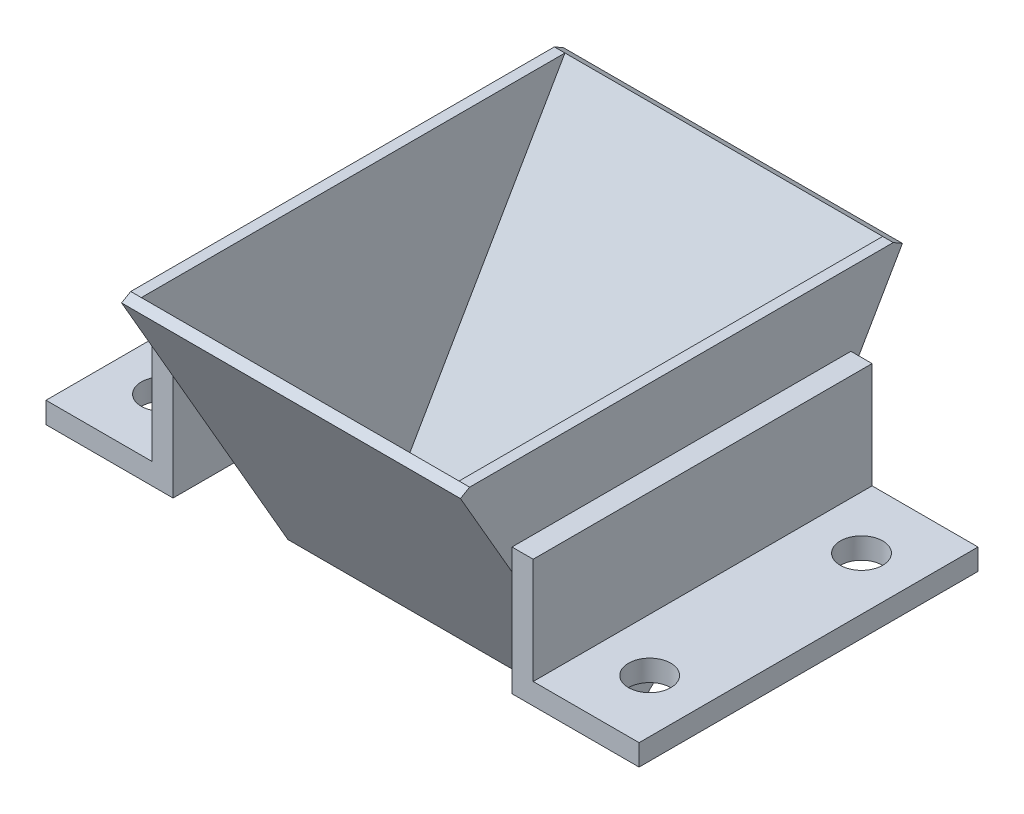
ISO-10303-21;
HEADER;
FILE_DESCRIPTION(('STEP AP214'),'2;1');
FILE_NAME('part.step','',(''),(''),'','','');
FILE_SCHEMA(('AUTOMOTIVE_DESIGN { 1 0 10303 214 1 1 1 1 }'));
ENDSEC;
DATA;
#1=APPLICATION_CONTEXT('core data for automotive mechanical design processes');
#2=APPLICATION_PROTOCOL_DEFINITION('international standard','automotive_design',2000,#1);
#3=PRODUCT_CONTEXT('',#1,'mechanical');
#4=PRODUCT('Part','Part','',(#3));
#5=PRODUCT_RELATED_PRODUCT_CATEGORY('part','',(#4));
#6=PRODUCT_DEFINITION_FORMATION('','',#4);
#7=PRODUCT_DEFINITION_CONTEXT('part definition',#1,'design');
#8=PRODUCT_DEFINITION('design','',#6,#7);
#9=PRODUCT_DEFINITION_SHAPE('','',#8);
#10=(LENGTH_UNIT() NAMED_UNIT(*) SI_UNIT(.MILLI.,.METRE.));
#11=(NAMED_UNIT(*) PLANE_ANGLE_UNIT() SI_UNIT($,.RADIAN.));
#12=(NAMED_UNIT(*) SI_UNIT($,.STERADIAN.) SOLID_ANGLE_UNIT());
#13=UNCERTAINTY_MEASURE_WITH_UNIT(LENGTH_MEASURE(1.E-05),#10,'distance_accuracy_value','');
#14=(GEOMETRIC_REPRESENTATION_CONTEXT(3) GLOBAL_UNCERTAINTY_ASSIGNED_CONTEXT((#13)) GLOBAL_UNIT_ASSIGNED_CONTEXT((#10,
#11,#12)) REPRESENTATION_CONTEXT('',''));
#15=CARTESIAN_POINT('',(0.,0.,0.));
#16=DIRECTION('',(0.,0.,1.));
#17=DIRECTION('',(1.,0.,0.));
#18=AXIS2_PLACEMENT_3D('',#15,#16,#17);
#19=CARTESIAN_POINT('',(1.5875,0.,0.));
#20=DIRECTION('',(1.,0.,0.));
#21=DIRECTION('',(0.,0.,-1.));
#22=AXIS2_PLACEMENT_3D('',#19,#20,#21);
#23=PLANE('',#22);
#24=DIRECTION('',(0.,0.,-1.));
#25=VECTOR('',#24,1.);
#26=CARTESIAN_POINT('',(1.5875,14.,25.4));
#27=LINE('',#26,#25);
#28=CARTESIAN_POINT('',(1.5875,14.,16.2659908733318));
#29=VERTEX_POINT('',#28);
#30=CARTESIAN_POINT('',(1.5875,14.,-16.2659908733318));
#31=VERTEX_POINT('',#30);
#32=EDGE_CURVE('E11',#29,#31,#27,.T.);
#33=ORIENTED_EDGE('',*,*,#32,.F.);
#34=DIRECTION('',(0.,-0.86602540378444,-0.499999999999998));
#35=VECTOR('',#34,1.);
#36=CARTESIAN_POINT('',(1.5875,-0.793749999999999,7.7248153285078));
#37=LINE('',#36,#35);
#38=CARTESIAN_POINT('',(1.5875,0.,8.18308710467707));
#39=VERTEX_POINT('',#38);
#40=EDGE_CURVE('E379',#29,#39,#37,.T.);
#41=ORIENTED_EDGE('',*,*,#40,.T.);
#42=DIRECTION('',(0.,0.,-1.));
#43=VECTOR('',#42,1.);
#44=CARTESIAN_POINT('',(1.5875,0.,-8.18308710467707));
#45=LINE('',#44,#43);
#46=CARTESIAN_POINT('',(1.5875,0.,6.34999999999998));
#47=VERTEX_POINT('',#46);
#48=EDGE_CURVE('E342',#39,#47,#45,.T.);
#49=ORIENTED_EDGE('',*,*,#48,.T.);
#50=CARTESIAN_POINT('',(1.5875,0.,0.));
#51=DIRECTION('',(-1.,0.,0.));
#52=DIRECTION('',(0.,0.,-1.));
#53=AXIS2_PLACEMENT_3D('',#50,#51,#52);
#54=CIRCLE('',#53,6.35);
#55=CARTESIAN_POINT('',(1.5875,0.,-6.35));
#56=VERTEX_POINT('',#55);
#57=EDGE_CURVE('E423',#47,#56,#54,.T.);
#58=ORIENTED_EDGE('',*,*,#57,.T.);
#59=CARTESIAN_POINT('',(1.5875,0.,-8.18308710467707));
#60=VERTEX_POINT('',#59);
#61=EDGE_CURVE('E346',#56,#60,#45,.T.);
#62=ORIENTED_EDGE('',*,*,#61,.T.);
#63=DIRECTION('',(0.,-0.86602540378444,0.499999999999998));
#64=VECTOR('',#63,1.);
#65=CARTESIAN_POINT('',(1.5875,-0.793749999999999,-7.7248153285078));
#66=LINE('',#65,#64);
#67=EDGE_CURVE('E404',#31,#60,#66,.T.);
#68=ORIENTED_EDGE('',*,*,#67,.F.);
#69=EDGE_LOOP('',(#33,#41,#49,#58,#62,#68));
#70=FACE_BOUND('',#69,.T.);
#71=ADVANCED_FACE('F32',(#70),#23,.T.);
#72=CARTESIAN_POINT('',(-49.2125,-0.793749999999999,-7.7248153285078));
#73=DIRECTION('',(1.,0.,0.));
#74=DIRECTION('',(0.,0.,-1.));
#75=AXIS2_PLACEMENT_3D('',#72,#73,#74);
#76=PLANE('',#75);
#77=DIRECTION('',(0.,0.86602540378444,-0.499999999999998));
#78=VECTOR('',#77,1.);
#79=CARTESIAN_POINT('',(-49.2125,-0.793749999999999,-7.7248153285078));
#80=LINE('',#79,#78);
#81=CARTESIAN_POINT('',(-49.2125,29.8205678841873,-25.4));
#82=VERTEX_POINT('',#81);
#83=CARTESIAN_POINT('',(-49.2125,43.2003405122495,-33.1248153285077));
#84=VERTEX_POINT('',#83);
#85=EDGE_CURVE('E402',#82,#84,#80,.T.);
#86=ORIENTED_EDGE('',*,*,#85,.F.);
#87=DIRECTION('',(0.,1.,0.));
#88=VECTOR('',#87,1.);
#89=CARTESIAN_POINT('',(-49.2125,33.05,-25.4));
#90=LINE('',#89,#88);
#91=CARTESIAN_POINT('',(-49.2125,33.05,-25.4));
#92=VERTEX_POINT('',#91);
#93=EDGE_CURVE('E245',#82,#92,#90,.T.);
#94=ORIENTED_EDGE('',*,*,#93,.T.);
#95=DIRECTION('',(0.,0.,-1.));
#96=VECTOR('',#95,1.);
#97=CARTESIAN_POINT('',(-49.2125,33.05,25.4));
#98=LINE('',#97,#96);
#99=CARTESIAN_POINT('',(-49.2125,33.05,25.4));
#100=VERTEX_POINT('',#99);
#101=EDGE_CURVE('E311',#100,#92,#98,.T.);
#102=ORIENTED_EDGE('',*,*,#101,.F.);
#103=DIRECTION('',(0.,1.,0.));
#104=VECTOR('',#103,1.);
#105=CARTESIAN_POINT('',(-49.2125,33.05,25.4));
#106=LINE('',#105,#104);
#107=CARTESIAN_POINT('',(-49.2125,29.8205678841873,25.4));
#108=VERTEX_POINT('',#107);
#109=EDGE_CURVE('E250',#108,#100,#106,.T.);
#110=ORIENTED_EDGE('',*,*,#109,.F.);
#111=DIRECTION('',(0.,0.86602540378444,0.499999999999998));
#112=VECTOR('',#111,1.);
#113=CARTESIAN_POINT('',(-49.2125,-0.793749999999999,7.7248153285078));
#114=LINE('',#113,#112);
#115=CARTESIAN_POINT('',(-49.2125,43.2003405122495,33.1248153285077));
#116=VERTEX_POINT('',#115);
#117=EDGE_CURVE('E382',#108,#116,#114,.T.);
#118=ORIENTED_EDGE('',*,*,#117,.T.);
#119=DIRECTION('',(0.,0.499999999999998,-0.86602540378444));
#120=VECTOR('',#119,1.);
#121=CARTESIAN_POINT('',(-49.2125,43.2003405122495,33.1248153285077));
#122=LINE('',#121,#120);
#123=CARTESIAN_POINT('',(-49.2125,43.9940905122495,31.7499999999999));
#124=VERTEX_POINT('',#123);
#125=EDGE_CURVE('E386',#116,#124,#122,.T.);
#126=ORIENTED_EDGE('',*,*,#125,.T.);
#127=DIRECTION('',(0.,0.,1.));
#128=VECTOR('',#127,1.);
#129=CARTESIAN_POINT('',(-49.2125,43.9940905122495,31.7499999999999));
#130=LINE('',#129,#128);
#131=CARTESIAN_POINT('',(-49.2125,43.9940905122495,-31.7499999999999));
#132=VERTEX_POINT('',#131);
#133=EDGE_CURVE('E357',#132,#124,#130,.T.);
#134=ORIENTED_EDGE('',*,*,#133,.F.);
#135=DIRECTION('',(0.,0.499999999999998,0.86602540378444));
#136=VECTOR('',#135,1.);
#137=CARTESIAN_POINT('',(-49.2125,43.2003405122495,-33.1248153285077));
#138=LINE('',#137,#136);
#139=EDGE_CURVE('E419',#84,#132,#138,.T.);
#140=ORIENTED_EDGE('',*,*,#139,.F.);
#141=EDGE_LOOP('',(#86,#94,#102,#110,#118,#126,#134,#140));
#142=FACE_BOUND('',#141,.T.);
#143=ADVANCED_FACE('F472',(#142),#76,.F.);
#144=CARTESIAN_POINT('',(0.,-2.74963065701559,-4.76250000000002));
#145=DIRECTION('',(0.,0.499999999999998,0.86602540378444));
#146=DIRECTION('',(0.,-0.86602540378444,0.499999999999998));
#147=AXIS2_PLACEMENT_3D('',#144,#145,#146);
#148=PLANE('',#147);
#149=DIRECTION('',(1.,0.,0.));
#150=VECTOR('',#149,1.);
#151=CARTESIAN_POINT('',(1.5875,43.9940905122495,-31.7499999999999));
#152=LINE('',#151,#150);
#153=CARTESIAN_POINT('',(-47.625,43.9940905122495,-31.7499999999999));
#154=VERTEX_POINT('',#153);
#155=CARTESIAN_POINT('',(0.,43.9940905122495,-31.7499999999999));
#156=VERTEX_POINT('',#155);
#157=EDGE_CURVE('E413',#154,#156,#152,.T.);
#158=ORIENTED_EDGE('',*,*,#157,.F.);
#159=DIRECTION('',(0.,0.86602540378444,-0.499999999999998));
#160=VECTOR('',#159,1.);
#161=CARTESIAN_POINT('',(-47.625,43.9940905122495,-31.7499999999999));
#162=LINE('',#161,#160);
#163=CARTESIAN_POINT('',(-47.625,0.,-6.35));
#164=VERTEX_POINT('',#163);
#165=EDGE_CURVE('E358',#164,#154,#162,.T.);
#166=ORIENTED_EDGE('',*,*,#165,.F.);
#167=DIRECTION('',(-1.,0.,0.));
#168=VECTOR('',#167,1.);
#169=CARTESIAN_POINT('',(1.5875,0.,-6.35));
#170=LINE('',#169,#168);
#171=CARTESIAN_POINT('',(0.,0.,-6.35));
#172=VERTEX_POINT('',#171);
#173=EDGE_CURVE('E398',#172,#164,#170,.T.);
#174=ORIENTED_EDGE('',*,*,#173,.F.);
#175=DIRECTION('',(0.,0.86602540378444,-0.499999999999998));
#176=VECTOR('',#175,1.);
#177=CARTESIAN_POINT('',(0.,43.9940905122495,-31.7499999999999));
#178=LINE('',#177,#176);
#179=EDGE_CURVE('E432',#172,#156,#178,.T.);
#180=ORIENTED_EDGE('',*,*,#179,.T.);
#181=EDGE_LOOP('',(#158,#166,#174,#180));
#182=FACE_BOUND('',#181,.T.);
#183=ADVANCED_FACE('F478',(#182),#148,.T.);
#184=CARTESIAN_POINT('',(0.,-2.74963065701559,4.76250000000002));
#185=DIRECTION('',(0.,0.499999999999998,-0.86602540378444));
#186=DIRECTION('',(0.,-0.86602540378444,-0.499999999999998));
#187=AXIS2_PLACEMENT_3D('',#184,#185,#186);
#188=PLANE('',#187);
#189=DIRECTION('',(-1.,0.,0.));
#190=VECTOR('',#189,1.);
#191=CARTESIAN_POINT('',(1.5875,0.,6.35));
#192=LINE('',#191,#190);
#193=CARTESIAN_POINT('',(0.,0.,6.35));
#194=VERTEX_POINT('',#193);
#195=CARTESIAN_POINT('',(-47.625,0.,6.35));
#196=VERTEX_POINT('',#195);
#197=EDGE_CURVE('E391',#194,#196,#192,.T.);
#198=ORIENTED_EDGE('',*,*,#197,.T.);
#199=DIRECTION('',(0.,-0.86602540378444,-0.499999999999998));
#200=VECTOR('',#199,1.);
#201=CARTESIAN_POINT('',(-47.625,0.,6.35));
#202=LINE('',#201,#200);
#203=CARTESIAN_POINT('',(-47.625,43.9940905122495,31.7499999999999));
#204=VERTEX_POINT('',#203);
#205=EDGE_CURVE('E364',#204,#196,#202,.T.);
#206=ORIENTED_EDGE('',*,*,#205,.F.);
#207=DIRECTION('',(1.,0.,0.));
#208=VECTOR('',#207,1.);
#209=CARTESIAN_POINT('',(1.5875,43.9940905122495,31.7499999999999));
#210=LINE('',#209,#208);
#211=CARTESIAN_POINT('',(0.,43.9940905122495,31.7499999999999));
#212=VERTEX_POINT('',#211);
#213=EDGE_CURVE('E375',#204,#212,#210,.T.);
#214=ORIENTED_EDGE('',*,*,#213,.T.);
#215=DIRECTION('',(0.,-0.86602540378444,-0.499999999999998));
#216=VECTOR('',#215,1.);
#217=CARTESIAN_POINT('',(0.,0.,6.35));
#218=LINE('',#217,#216);
#219=EDGE_CURVE('E427',#212,#194,#218,.T.);
#220=ORIENTED_EDGE('',*,*,#219,.T.);
#221=EDGE_LOOP('',(#198,#206,#214,#220));
#222=FACE_BOUND('',#221,.T.);
#223=ADVANCED_FACE('F496',(#222),#188,.T.);
#224=CARTESIAN_POINT('',(1.5875,0.,0.));
#225=DIRECTION('',(-1.,0.,0.));
#226=DIRECTION('',(0.,0.,1.));
#227=AXIS2_PLACEMENT_3D('',#224,#225,#226);
#228=CYLINDRICAL_SURFACE('',#227,6.35);
#229=CARTESIAN_POINT('',(0.,0.,0.));
#230=DIRECTION('',(-1.,0.,0.));
#231=DIRECTION('',(0.,0.,-1.));
#232=AXIS2_PLACEMENT_3D('',#229,#230,#231);
#233=CIRCLE('',#232,6.35);
#234=EDGE_CURVE('E422',#194,#172,#233,.T.);
#235=ORIENTED_EDGE('',*,*,#234,.T.);
#236=DIRECTION('',(-1.,0.,0.));
#237=VECTOR('',#236,1.);
#238=CARTESIAN_POINT('',(1.5875,0.,-6.35));
#239=LINE('',#238,#237);
#240=EDGE_CURVE('E448',#56,#172,#239,.T.);
#241=ORIENTED_EDGE('',*,*,#240,.F.);
#242=ORIENTED_EDGE('',*,*,#57,.F.);
#243=DIRECTION('',(-1.,0.,0.));
#244=VECTOR('',#243,1.);
#245=CARTESIAN_POINT('',(1.5875,0.,6.35));
#246=LINE('',#245,#244);
#247=EDGE_CURVE('E429',#47,#194,#246,.T.);
#248=ORIENTED_EDGE('',*,*,#247,.T.);
#249=EDGE_LOOP('',(#235,#241,#242,#248));
#250=FACE_BOUND('',#249,.T.);
#251=ADVANCED_FACE('F34',(#250),#228,.F.);
#252=CARTESIAN_POINT('',(1.5875,43.9940905122495,31.7499999999999));
#253=DIRECTION('',(0.,-1.,0.));
#254=DIRECTION('',(0.,0.,-1.));
#255=AXIS2_PLACEMENT_3D('',#252,#253,#254);
#256=PLANE('',#255);
#257=DIRECTION('',(0.,0.,1.));
#258=VECTOR('',#257,1.);
#259=CARTESIAN_POINT('',(0.,43.9940905122495,31.7499999999999));
#260=LINE('',#259,#258);
#261=EDGE_CURVE('E435',#156,#212,#260,.T.);
#262=ORIENTED_EDGE('',*,*,#261,.T.);
#263=DIRECTION('',(-1.,0.,0.));
#264=VECTOR('',#263,1.);
#265=CARTESIAN_POINT('',(1.5875,43.9940905122495,31.7499999999999));
#266=LINE('',#265,#264);
#267=CARTESIAN_POINT('',(1.5875,43.9940905122495,31.7499999999999));
#268=VERTEX_POINT('',#267);
#269=EDGE_CURVE('E442',#268,#212,#266,.T.);
#270=ORIENTED_EDGE('',*,*,#269,.F.);
#271=DIRECTION('',(0.,0.,1.));
#272=VECTOR('',#271,1.);
#273=CARTESIAN_POINT('',(1.5875,43.9940905122495,31.7499999999999));
#274=LINE('',#273,#272);
#275=CARTESIAN_POINT('',(1.5875,43.9940905122495,-31.7499999999999));
#276=VERTEX_POINT('',#275);
#277=EDGE_CURVE('E426',#276,#268,#274,.T.);
#278=ORIENTED_EDGE('',*,*,#277,.F.);
#279=DIRECTION('',(-1.,0.,0.));
#280=VECTOR('',#279,1.);
#281=CARTESIAN_POINT('',(1.5875,43.9940905122495,-31.7499999999999));
#282=LINE('',#281,#280);
#283=EDGE_CURVE('E445',#276,#156,#282,.T.);
#284=ORIENTED_EDGE('',*,*,#283,.T.);
#285=EDGE_LOOP('',(#262,#270,#278,#284));
#286=FACE_BOUND('',#285,.T.);
#287=ADVANCED_FACE('F486',(#286),#256,.F.);
#288=DIRECTION('',(0.,1.,0.));
#289=VECTOR('',#288,1.);
#290=CARTESIAN_POINT('',(1.5875,33.05,-25.4));
#291=LINE('',#290,#289);
#292=CARTESIAN_POINT('',(1.5875,29.8205678841872,-25.4));
#293=VERTEX_POINT('',#292);
#294=CARTESIAN_POINT('',(1.5875,33.05,-25.4));
#295=VERTEX_POINT('',#294);
#296=EDGE_CURVE('E41',#293,#295,#291,.T.);
#297=ORIENTED_EDGE('',*,*,#296,.F.);
#298=CARTESIAN_POINT('',(1.5875,43.2003405122496,-33.1248153285077));
#299=VERTEX_POINT('',#298);
#300=EDGE_CURVE('E399',#299,#293,#66,.T.);
#301=ORIENTED_EDGE('',*,*,#300,.F.);
#302=DIRECTION('',(0.,0.499999999999998,0.86602540378444));
#303=VECTOR('',#302,1.);
#304=CARTESIAN_POINT('',(1.5875,43.2003405122496,-33.1248153285077));
#305=LINE('',#304,#303);
#306=EDGE_CURVE('E411',#299,#276,#305,.T.);
#307=ORIENTED_EDGE('',*,*,#306,.T.);
#308=ORIENTED_EDGE('',*,*,#277,.T.);
#309=DIRECTION('',(0.,0.499999999999998,-0.86602540378444));
#310=VECTOR('',#309,1.);
#311=CARTESIAN_POINT('',(1.5875,43.2003405122496,33.1248153285077));
#312=LINE('',#311,#310);
#313=CARTESIAN_POINT('',(1.5875,43.2003405122496,33.1248153285077));
#314=VERTEX_POINT('',#313);
#315=EDGE_CURVE('E395',#314,#268,#312,.T.);
#316=ORIENTED_EDGE('',*,*,#315,.F.);
#317=CARTESIAN_POINT('',(1.5875,29.8205678841872,25.4));
#318=VERTEX_POINT('',#317);
#319=EDGE_CURVE('E244',#314,#318,#37,.T.);
#320=ORIENTED_EDGE('',*,*,#319,.T.);
#321=DIRECTION('',(0.,1.,0.));
#322=VECTOR('',#321,1.);
#323=CARTESIAN_POINT('',(1.5875,33.05,25.4));
#324=LINE('',#323,#322);
#325=CARTESIAN_POINT('',(1.5875,33.05,25.4));
#326=VERTEX_POINT('',#325);
#327=EDGE_CURVE('E233',#318,#326,#324,.T.);
#328=ORIENTED_EDGE('',*,*,#327,.T.);
#329=DIRECTION('',(0.,0.,-1.));
#330=VECTOR('',#329,1.);
#331=CARTESIAN_POINT('',(1.5875,33.05,25.4));
#332=LINE('',#331,#330);
#333=EDGE_CURVE('E220',#326,#295,#332,.T.);
#334=ORIENTED_EDGE('',*,*,#333,.T.);
#335=EDGE_LOOP('',(#297,#301,#307,#308,#316,#320,#328,#334));
#336=FACE_BOUND('',#335,.T.);
#337=ADVANCED_FACE('F242',(#336),#23,.T.);
#338=CARTESIAN_POINT('',(0.,0.,0.));
#339=DIRECTION('',(1.,0.,0.));
#340=DIRECTION('',(0.,0.,-1.));
#341=AXIS2_PLACEMENT_3D('',#338,#339,#340);
#342=PLANE('',#341);
#343=ORIENTED_EDGE('',*,*,#234,.F.);
#344=ORIENTED_EDGE('',*,*,#219,.F.);
#345=ORIENTED_EDGE('',*,*,#261,.F.);
#346=ORIENTED_EDGE('',*,*,#179,.F.);
#347=EDGE_LOOP('',(#343,#344,#345,#346));
#348=FACE_BOUND('',#347,.T.);
#349=ADVANCED_FACE('F485',(#348),#342,.F.);
#350=CARTESIAN_POINT('',(-49.2125,0.,8.18308710467707));
#351=VERTEX_POINT('',#350);
#352=CARTESIAN_POINT('',(-49.2125,14.,16.2659908733318));
#353=VERTEX_POINT('',#352);
#354=EDGE_CURVE('E383',#351,#353,#114,.T.);
#355=ORIENTED_EDGE('',*,*,#354,.T.);
#356=DIRECTION('',(0.,0.,-1.));
#357=VECTOR('',#356,1.);
#358=CARTESIAN_POINT('',(-49.2125,14.,25.4));
#359=LINE('',#358,#357);
#360=CARTESIAN_POINT('',(-49.2125,14.,-16.2659908733318));
#361=VERTEX_POINT('',#360);
#362=EDGE_CURVE('E329',#353,#361,#359,.T.);
#363=ORIENTED_EDGE('',*,*,#362,.T.);
#364=CARTESIAN_POINT('',(-49.2125,0.,-8.18308710467707));
#365=VERTEX_POINT('',#364);
#366=EDGE_CURVE('E405',#365,#361,#80,.T.);
#367=ORIENTED_EDGE('',*,*,#366,.F.);
#368=DIRECTION('',(0.,0.,-1.));
#369=VECTOR('',#368,1.);
#370=CARTESIAN_POINT('',(-49.2125,0.,-8.18308710467707));
#371=LINE('',#370,#369);
#372=CARTESIAN_POINT('',(-49.2125,0.,-6.35));
#373=VERTEX_POINT('',#372);
#374=EDGE_CURVE('E341',#373,#365,#371,.T.);
#375=ORIENTED_EDGE('',*,*,#374,.F.);
#376=CARTESIAN_POINT('',(-49.2125,0.,0.));
#377=DIRECTION('',(-1.,0.,0.));
#378=DIRECTION('',(0.,0.,-1.));
#379=AXIS2_PLACEMENT_3D('',#376,#377,#378);
#380=CIRCLE('',#379,6.35);
#381=CARTESIAN_POINT('',(-49.2125,0.,6.35));
#382=VERTEX_POINT('',#381);
#383=EDGE_CURVE('E354',#382,#373,#380,.T.);
#384=ORIENTED_EDGE('',*,*,#383,.F.);
#385=EDGE_CURVE('E347',#351,#382,#371,.T.);
#386=ORIENTED_EDGE('',*,*,#385,.F.);
#387=EDGE_LOOP('',(#355,#363,#367,#375,#384,#386));
#388=FACE_BOUND('',#387,.T.);
#389=ADVANCED_FACE('F481',(#388),#76,.F.);
#390=CARTESIAN_POINT('',(1.5875,43.2003405122496,-33.1248153285077));
#391=DIRECTION('',(0.,-0.86602540378444,0.499999999999998));
#392=DIRECTION('',(0.,-0.499999999999998,-0.86602540378444));
#393=AXIS2_PLACEMENT_3D('',#390,#391,#392);
#394=PLANE('',#393);
#395=EDGE_CURVE('E414',#132,#154,#152,.T.);
#396=ORIENTED_EDGE('',*,*,#395,.T.);
#397=ORIENTED_EDGE('',*,*,#157,.T.);
#398=ORIENTED_EDGE('',*,*,#283,.F.);
#399=ORIENTED_EDGE('',*,*,#306,.F.);
#400=DIRECTION('',(1.,0.,0.));
#401=VECTOR('',#400,1.);
#402=CARTESIAN_POINT('',(1.5875,43.2003405122496,-33.1248153285077));
#403=LINE('',#402,#401);
#404=EDGE_CURVE('E408',#84,#299,#403,.T.);
#405=ORIENTED_EDGE('',*,*,#404,.F.);
#406=ORIENTED_EDGE('',*,*,#139,.T.);
#407=EDGE_LOOP('',(#396,#397,#398,#399,#405,#406));
#408=FACE_BOUND('',#407,.T.);
#409=ADVANCED_FACE('F551',(#408),#394,.F.);
#410=CARTESIAN_POINT('',(0.,-3.54338065701559,-6.13731532850782));
#411=DIRECTION('',(0.,0.499999999999998,0.86602540378444));
#412=DIRECTION('',(0.,-0.86602540378444,0.499999999999998));
#413=AXIS2_PLACEMENT_3D('',#410,#411,#412);
#414=PLANE('',#413);
#415=ORIENTED_EDGE('',*,*,#300,.T.);
#416=EDGE_CURVE('E403',#293,#31,#66,.T.);
#417=ORIENTED_EDGE('',*,*,#416,.T.);
#418=ORIENTED_EDGE('',*,*,#67,.T.);
#419=DIRECTION('',(-1.,0.,0.));
#420=VECTOR('',#419,1.);
#421=CARTESIAN_POINT('',(1.5875,0.,-8.18308710467707));
#422=LINE('',#421,#420);
#423=EDGE_CURVE('E349',#60,#365,#422,.T.);
#424=ORIENTED_EDGE('',*,*,#423,.T.);
#425=ORIENTED_EDGE('',*,*,#366,.T.);
#426=EDGE_CURVE('E409',#361,#82,#80,.T.);
#427=ORIENTED_EDGE('',*,*,#426,.T.);
#428=ORIENTED_EDGE('',*,*,#85,.T.);
#429=ORIENTED_EDGE('',*,*,#404,.T.);
#430=EDGE_LOOP('',(#415,#417,#418,#424,#425,#427,#428,#429));
#431=FACE_BOUND('',#430,.T.);
#432=ADVANCED_FACE('F549',(#431),#414,.F.);
#433=CARTESIAN_POINT('',(1.5875,43.2003405122496,33.1248153285077));
#434=DIRECTION('',(0.,0.86602540378444,0.499999999999998));
#435=DIRECTION('',(0.,-0.499999999999998,0.86602540378444));
#436=AXIS2_PLACEMENT_3D('',#433,#434,#435);
#437=PLANE('',#436);
#438=EDGE_CURVE('E388',#124,#204,#210,.T.);
#439=ORIENTED_EDGE('',*,*,#438,.F.);
#440=ORIENTED_EDGE('',*,*,#125,.F.);
#441=DIRECTION('',(1.,0.,0.));
#442=VECTOR('',#441,1.);
#443=CARTESIAN_POINT('',(1.5875,43.2003405122496,33.1248153285077));
#444=LINE('',#443,#442);
#445=EDGE_CURVE('E377',#116,#314,#444,.T.);
#446=ORIENTED_EDGE('',*,*,#445,.T.);
#447=ORIENTED_EDGE('',*,*,#315,.T.);
#448=ORIENTED_EDGE('',*,*,#269,.T.);
#449=ORIENTED_EDGE('',*,*,#213,.F.);
#450=EDGE_LOOP('',(#439,#440,#446,#447,#448,#449));
#451=FACE_BOUND('',#450,.T.);
#452=ADVANCED_FACE('F508',(#451),#437,.T.);
#453=CARTESIAN_POINT('',(0.,-3.54338065701559,6.13731532850782));
#454=DIRECTION('',(0.,0.499999999999998,-0.86602540378444));
#455=DIRECTION('',(0.,-0.86602540378444,-0.499999999999998));
#456=AXIS2_PLACEMENT_3D('',#453,#454,#455);
#457=PLANE('',#456);
#458=ORIENTED_EDGE('',*,*,#354,.F.);
#459=DIRECTION('',(-1.,0.,0.));
#460=VECTOR('',#459,1.);
#461=CARTESIAN_POINT('',(1.5875,0.,8.18308710467707));
#462=LINE('',#461,#460);
#463=EDGE_CURVE('E345',#39,#351,#462,.T.);
#464=ORIENTED_EDGE('',*,*,#463,.F.);
#465=ORIENTED_EDGE('',*,*,#40,.F.);
#466=EDGE_CURVE('E378',#318,#29,#37,.T.);
#467=ORIENTED_EDGE('',*,*,#466,.F.);
#468=ORIENTED_EDGE('',*,*,#319,.F.);
#469=ORIENTED_EDGE('',*,*,#445,.F.);
#470=ORIENTED_EDGE('',*,*,#117,.F.);
#471=EDGE_CURVE('E387',#353,#108,#114,.T.);
#472=ORIENTED_EDGE('',*,*,#471,.F.);
#473=EDGE_LOOP('',(#458,#464,#465,#467,#468,#469,#470,#472));
#474=FACE_BOUND('',#473,.T.);
#475=ADVANCED_FACE('F513',(#474),#457,.F.);
#476=CARTESIAN_POINT('',(-49.2125,0.,0.));
#477=DIRECTION('',(1.,0.,0.));
#478=DIRECTION('',(0.,0.,-1.));
#479=AXIS2_PLACEMENT_3D('',#476,#477,#478);
#480=CYLINDRICAL_SURFACE('',#479,6.35);
#481=CARTESIAN_POINT('',(-47.625,0.,0.));
#482=DIRECTION('',(-1.,0.,0.));
#483=DIRECTION('',(0.,0.,-1.));
#484=AXIS2_PLACEMENT_3D('',#481,#482,#483);
#485=CIRCLE('',#484,6.35);
#486=EDGE_CURVE('E352',#196,#164,#485,.T.);
#487=ORIENTED_EDGE('',*,*,#486,.F.);
#488=DIRECTION('',(1.,0.,0.));
#489=VECTOR('',#488,1.);
#490=CARTESIAN_POINT('',(-49.2125,0.,6.35));
#491=LINE('',#490,#489);
#492=EDGE_CURVE('E373',#382,#196,#491,.T.);
#493=ORIENTED_EDGE('',*,*,#492,.F.);
#494=ORIENTED_EDGE('',*,*,#383,.T.);
#495=DIRECTION('',(1.,0.,0.));
#496=VECTOR('',#495,1.);
#497=CARTESIAN_POINT('',(-49.2125,0.,-6.35));
#498=LINE('',#497,#496);
#499=EDGE_CURVE('E361',#373,#164,#498,.T.);
#500=ORIENTED_EDGE('',*,*,#499,.T.);
#501=EDGE_LOOP('',(#487,#493,#494,#500));
#502=FACE_BOUND('',#501,.T.);
#503=ADVANCED_FACE('F532',(#502),#480,.F.);
#504=CARTESIAN_POINT('',(-49.2125,43.9940905122495,31.7499999999999));
#505=DIRECTION('',(0.,1.,0.));
#506=DIRECTION('',(0.,0.,1.));
#507=AXIS2_PLACEMENT_3D('',#504,#505,#506);
#508=PLANE('',#507);
#509=DIRECTION('',(0.,0.,1.));
#510=VECTOR('',#509,1.);
#511=CARTESIAN_POINT('',(-47.625,43.9940905122495,31.7499999999999));
#512=LINE('',#511,#510);
#513=EDGE_CURVE('E367',#154,#204,#512,.T.);
#514=ORIENTED_EDGE('',*,*,#513,.F.);
#515=ORIENTED_EDGE('',*,*,#395,.F.);
#516=ORIENTED_EDGE('',*,*,#133,.T.);
#517=ORIENTED_EDGE('',*,*,#438,.T.);
#518=EDGE_LOOP('',(#514,#515,#516,#517));
#519=FACE_BOUND('',#518,.T.);
#520=ADVANCED_FACE('F588',(#519),#508,.T.);
#521=CARTESIAN_POINT('',(-47.625,0.,0.));
#522=DIRECTION('',(-1.,0.,0.));
#523=DIRECTION('',(0.,0.,-1.));
#524=AXIS2_PLACEMENT_3D('',#521,#522,#523);
#525=PLANE('',#524);
#526=ORIENTED_EDGE('',*,*,#486,.T.);
#527=ORIENTED_EDGE('',*,*,#165,.T.);
#528=ORIENTED_EDGE('',*,*,#513,.T.);
#529=ORIENTED_EDGE('',*,*,#205,.T.);
#530=EDGE_LOOP('',(#526,#527,#528,#529));
#531=FACE_BOUND('',#530,.T.);
#532=ADVANCED_FACE('F535',(#531),#525,.F.);
#533=CARTESIAN_POINT('',(1.5875,0.,-8.18308710467707));
#534=DIRECTION('',(0.,1.,0.));
#535=DIRECTION('',(0.,0.,1.));
#536=AXIS2_PLACEMENT_3D('',#533,#534,#535);
#537=PLANE('',#536);
#538=ORIENTED_EDGE('',*,*,#173,.T.);
#539=ORIENTED_EDGE('',*,*,#499,.F.);
#540=ORIENTED_EDGE('',*,*,#374,.T.);
#541=ORIENTED_EDGE('',*,*,#423,.F.);
#542=ORIENTED_EDGE('',*,*,#61,.F.);
#543=ORIENTED_EDGE('',*,*,#240,.T.);
#544=EDGE_LOOP('',(#538,#539,#540,#541,#542,#543));
#545=FACE_BOUND('',#544,.T.);
#546=ADVANCED_FACE('F601',(#545),#537,.F.);
#547=ORIENTED_EDGE('',*,*,#48,.F.);
#548=ORIENTED_EDGE('',*,*,#463,.T.);
#549=ORIENTED_EDGE('',*,*,#385,.T.);
#550=ORIENTED_EDGE('',*,*,#492,.T.);
#551=ORIENTED_EDGE('',*,*,#197,.F.);
#552=ORIENTED_EDGE('',*,*,#247,.F.);
#553=EDGE_LOOP('',(#547,#548,#549,#550,#551,#552));
#554=FACE_BOUND('',#553,.T.);
#555=ADVANCED_FACE('F521',(#554),#537,.F.);
#556=CARTESIAN_POINT('',(-49.2125,33.05,25.4));
#557=DIRECTION('',(-1.,0.,0.));
#558=DIRECTION('',(0.,0.,1.));
#559=AXIS2_PLACEMENT_3D('',#556,#557,#558);
#560=PLANE('',#559);
#561=CARTESIAN_POINT('',(-49.2125,14.,25.4));
#562=VERTEX_POINT('',#561);
#563=EDGE_CURVE('E325',#562,#353,#359,.T.);
#564=ORIENTED_EDGE('',*,*,#563,.T.);
#565=ORIENTED_EDGE('',*,*,#471,.T.);
#566=EDGE_CURVE('E308',#562,#108,#106,.T.);
#567=ORIENTED_EDGE('',*,*,#566,.F.);
#568=EDGE_LOOP('',(#564,#565,#567));
#569=FACE_BOUND('',#568,.T.);
#570=ADVANCED_FACE('F615',(#569),#560,.F.);
#571=CARTESIAN_POINT('',(-52.3875,33.05,25.4));
#572=DIRECTION('',(0.,-1.,0.));
#573=DIRECTION('',(0.,0.,-1.));
#574=AXIS2_PLACEMENT_3D('',#571,#572,#573);
#575=PLANE('',#574);
#576=DIRECTION('',(-1.,0.,0.));
#577=VECTOR('',#576,1.);
#578=CARTESIAN_POINT('',(-52.3875,33.05,-25.4));
#579=LINE('',#578,#577);
#580=CARTESIAN_POINT('',(-52.3875,33.05,-25.4));
#581=VERTEX_POINT('',#580);
#582=EDGE_CURVE('E312',#92,#581,#579,.T.);
#583=ORIENTED_EDGE('',*,*,#582,.T.);
#584=DIRECTION('',(0.,0.,-1.));
#585=VECTOR('',#584,1.);
#586=CARTESIAN_POINT('',(-52.3875,33.05,25.4));
#587=LINE('',#586,#585);
#588=CARTESIAN_POINT('',(-52.3875,33.05,25.4));
#589=VERTEX_POINT('',#588);
#590=EDGE_CURVE('E338',#589,#581,#587,.T.);
#591=ORIENTED_EDGE('',*,*,#590,.F.);
#592=DIRECTION('',(-1.,0.,0.));
#593=VECTOR('',#592,1.);
#594=CARTESIAN_POINT('',(-52.3875,33.05,25.4));
#595=LINE('',#594,#593);
#596=EDGE_CURVE('E297',#100,#589,#595,.T.);
#597=ORIENTED_EDGE('',*,*,#596,.F.);
#598=ORIENTED_EDGE('',*,*,#101,.T.);
#599=EDGE_LOOP('',(#583,#591,#597,#598));
#600=FACE_BOUND('',#599,.T.);
#601=ADVANCED_FACE('F620',(#600),#575,.F.);
#602=CARTESIAN_POINT('',(-52.3875,17.175,25.4));
#603=DIRECTION('',(1.,0.,0.));
#604=DIRECTION('',(0.,0.,-1.));
#605=AXIS2_PLACEMENT_3D('',#602,#603,#604);
#606=PLANE('',#605);
#607=DIRECTION('',(0.,-1.,0.));
#608=VECTOR('',#607,1.);
#609=CARTESIAN_POINT('',(-52.3875,17.175,-25.4));
#610=LINE('',#609,#608);
#611=CARTESIAN_POINT('',(-52.3875,17.175,-25.4));
#612=VERTEX_POINT('',#611);
#613=EDGE_CURVE('E315',#581,#612,#610,.T.);
#614=ORIENTED_EDGE('',*,*,#613,.T.);
#615=DIRECTION('',(0.,0.,-1.));
#616=VECTOR('',#615,1.);
#617=CARTESIAN_POINT('',(-52.3875,17.175,25.4));
#618=LINE('',#617,#616);
#619=CARTESIAN_POINT('',(-52.3875,17.175,25.4));
#620=VERTEX_POINT('',#619);
#621=EDGE_CURVE('E335',#620,#612,#618,.T.);
#622=ORIENTED_EDGE('',*,*,#621,.F.);
#623=DIRECTION('',(0.,-1.,0.));
#624=VECTOR('',#623,1.);
#625=CARTESIAN_POINT('',(-52.3875,17.175,25.4));
#626=LINE('',#625,#624);
#627=EDGE_CURVE('E300',#589,#620,#626,.T.);
#628=ORIENTED_EDGE('',*,*,#627,.F.);
#629=ORIENTED_EDGE('',*,*,#590,.T.);
#630=EDGE_LOOP('',(#614,#622,#628,#629));
#631=FACE_BOUND('',#630,.T.);
#632=ADVANCED_FACE('F629',(#631),#606,.F.);
#633=CARTESIAN_POINT('',(-68.2625,17.175,25.4));
#634=DIRECTION('',(0.,-1.,0.));
#635=DIRECTION('',(0.,0.,-1.));
#636=AXIS2_PLACEMENT_3D('',#633,#634,#635);
#637=PLANE('',#636);
#638=CARTESIAN_POINT('',(-60.325,17.175,15.875));
#639=DIRECTION('',(0.,1.,0.));
#640=DIRECTION('',(0.,0.,1.));
#641=AXIS2_PLACEMENT_3D('',#638,#639,#640);
#642=CIRCLE('',#641,3.175);
#643=CARTESIAN_POINT('',(-60.325,17.175,19.05));
#644=VERTEX_POINT('',#643);
#645=EDGE_CURVE('E228',#644,#644,#642,.T.);
#646=ORIENTED_EDGE('',*,*,#645,.F.);
#647=EDGE_LOOP('',(#646));
#648=FACE_BOUND('',#647,.T.);
#649=CARTESIAN_POINT('',(-60.325,17.175,-15.875));
#650=DIRECTION('',(0.,1.,0.));
#651=DIRECTION('',(0.,0.,1.));
#652=AXIS2_PLACEMENT_3D('',#649,#650,#651);
#653=CIRCLE('',#652,3.175);
#654=CARTESIAN_POINT('',(-60.325,17.175,-12.7));
#655=VERTEX_POINT('',#654);
#656=EDGE_CURVE('E293',#655,#655,#653,.T.);
#657=ORIENTED_EDGE('',*,*,#656,.F.);
#658=EDGE_LOOP('',(#657));
#659=FACE_BOUND('',#658,.T.);
#660=DIRECTION('',(-1.,0.,0.));
#661=VECTOR('',#660,1.);
#662=CARTESIAN_POINT('',(-68.2625,17.175,-25.4));
#663=LINE('',#662,#661);
#664=CARTESIAN_POINT('',(-68.2625,17.175,-25.4));
#665=VERTEX_POINT('',#664);
#666=EDGE_CURVE('E317',#612,#665,#663,.T.);
#667=ORIENTED_EDGE('',*,*,#666,.T.);
#668=DIRECTION('',(0.,0.,-1.));
#669=VECTOR('',#668,1.);
#670=CARTESIAN_POINT('',(-68.2625,17.175,25.4));
#671=LINE('',#670,#669);
#672=CARTESIAN_POINT('',(-68.2625,17.175,25.4));
#673=VERTEX_POINT('',#672);
#674=EDGE_CURVE('E332',#673,#665,#671,.T.);
#675=ORIENTED_EDGE('',*,*,#674,.F.);
#676=DIRECTION('',(-1.,0.,0.));
#677=VECTOR('',#676,1.);
#678=CARTESIAN_POINT('',(-68.2625,17.175,25.4));
#679=LINE('',#678,#677);
#680=EDGE_CURVE('E302',#620,#673,#679,.T.);
#681=ORIENTED_EDGE('',*,*,#680,.F.);
#682=ORIENTED_EDGE('',*,*,#621,.T.);
#683=EDGE_LOOP('',(#667,#675,#681,#682));
#684=FACE_BOUND('',#683,.T.);
#685=ADVANCED_FACE('F637',(#648,#659,#684),#637,.F.);
#686=CARTESIAN_POINT('',(-68.2625,14.,25.4));
#687=DIRECTION('',(1.,0.,0.));
#688=DIRECTION('',(0.,0.,-1.));
#689=AXIS2_PLACEMENT_3D('',#686,#687,#688);
#690=PLANE('',#689);
#691=DIRECTION('',(0.,-1.,0.));
#692=VECTOR('',#691,1.);
#693=CARTESIAN_POINT('',(-68.2625,14.,-25.4));
#694=LINE('',#693,#692);
#695=CARTESIAN_POINT('',(-68.2625,14.,-25.4));
#696=VERTEX_POINT('',#695);
#697=EDGE_CURVE('E319',#665,#696,#694,.T.);
#698=ORIENTED_EDGE('',*,*,#697,.T.);
#699=DIRECTION('',(0.,0.,-1.));
#700=VECTOR('',#699,1.);
#701=CARTESIAN_POINT('',(-68.2625,14.,25.4));
#702=LINE('',#701,#700);
#703=CARTESIAN_POINT('',(-68.2625,14.,25.4));
#704=VERTEX_POINT('',#703);
#705=EDGE_CURVE('E328',#704,#696,#702,.T.);
#706=ORIENTED_EDGE('',*,*,#705,.F.);
#707=DIRECTION('',(0.,-1.,0.));
#708=VECTOR('',#707,1.);
#709=CARTESIAN_POINT('',(-68.2625,14.,25.4));
#710=LINE('',#709,#708);
#711=EDGE_CURVE('E304',#673,#704,#710,.T.);
#712=ORIENTED_EDGE('',*,*,#711,.F.);
#713=ORIENTED_EDGE('',*,*,#674,.T.);
#714=EDGE_LOOP('',(#698,#706,#712,#713));
#715=FACE_BOUND('',#714,.T.);
#716=ADVANCED_FACE('F646',(#715),#690,.F.);
#717=CARTESIAN_POINT('',(-49.2125,14.,25.4));
#718=DIRECTION('',(0.,1.,0.));
#719=DIRECTION('',(0.,0.,1.));
#720=AXIS2_PLACEMENT_3D('',#717,#718,#719);
#721=PLANE('',#720);
#722=CARTESIAN_POINT('',(-60.325,14.,15.875));
#723=DIRECTION('',(0.,1.,0.));
#724=DIRECTION('',(0.,0.,1.));
#725=AXIS2_PLACEMENT_3D('',#722,#723,#724);
#726=CIRCLE('',#725,3.175);
#727=CARTESIAN_POINT('',(-60.325,14.,19.05));
#728=VERTEX_POINT('',#727);
#729=EDGE_CURVE('E36',#728,#728,#726,.T.);
#730=ORIENTED_EDGE('',*,*,#729,.T.);
#731=EDGE_LOOP('',(#730));
#732=FACE_BOUND('',#731,.T.);
#733=CARTESIAN_POINT('',(-60.325,14.,-15.875));
#734=DIRECTION('',(0.,1.,0.));
#735=DIRECTION('',(0.,0.,1.));
#736=AXIS2_PLACEMENT_3D('',#733,#734,#735);
#737=CIRCLE('',#736,3.175);
#738=CARTESIAN_POINT('',(-60.325,14.,-12.7));
#739=VERTEX_POINT('',#738);
#740=EDGE_CURVE('E296',#739,#739,#737,.T.);
#741=ORIENTED_EDGE('',*,*,#740,.T.);
#742=EDGE_LOOP('',(#741));
#743=FACE_BOUND('',#742,.T.);
#744=DIRECTION('',(1.,0.,0.));
#745=VECTOR('',#744,1.);
#746=CARTESIAN_POINT('',(-49.2125,14.,-25.4));
#747=LINE('',#746,#745);
#748=CARTESIAN_POINT('',(-49.2125,14.,-25.4));
#749=VERTEX_POINT('',#748);
#750=EDGE_CURVE('E321',#696,#749,#747,.T.);
#751=ORIENTED_EDGE('',*,*,#750,.T.);
#752=EDGE_CURVE('E59',#361,#749,#359,.T.);
#753=ORIENTED_EDGE('',*,*,#752,.F.);
#754=ORIENTED_EDGE('',*,*,#362,.F.);
#755=ORIENTED_EDGE('',*,*,#563,.F.);
#756=DIRECTION('',(1.,0.,0.));
#757=VECTOR('',#756,1.);
#758=CARTESIAN_POINT('',(-49.2125,14.,25.4));
#759=LINE('',#758,#757);
#760=EDGE_CURVE('E306',#704,#562,#759,.T.);
#761=ORIENTED_EDGE('',*,*,#760,.F.);
#762=ORIENTED_EDGE('',*,*,#705,.T.);
#763=EDGE_LOOP('',(#751,#753,#754,#755,#761,#762));
#764=FACE_BOUND('',#763,.T.);
#765=ADVANCED_FACE('F452',(#732,#743,#764),#721,.F.);
#766=ORIENTED_EDGE('',*,*,#426,.F.);
#767=ORIENTED_EDGE('',*,*,#752,.T.);
#768=EDGE_CURVE('E252',#749,#82,#90,.T.);
#769=ORIENTED_EDGE('',*,*,#768,.T.);
#770=EDGE_LOOP('',(#766,#767,#769));
#771=FACE_BOUND('',#770,.T.);
#772=ADVANCED_FACE('F623',(#771),#560,.F.);
#773=CARTESIAN_POINT('',(0.,0.,25.4));
#774=DIRECTION('',(0.,0.,-1.));
#775=DIRECTION('',(-1.,0.,0.));
#776=AXIS2_PLACEMENT_3D('',#773,#774,#775);
#777=PLANE('',#776);
#778=ORIENTED_EDGE('',*,*,#596,.T.);
#779=ORIENTED_EDGE('',*,*,#627,.T.);
#780=ORIENTED_EDGE('',*,*,#680,.T.);
#781=ORIENTED_EDGE('',*,*,#711,.T.);
#782=ORIENTED_EDGE('',*,*,#760,.T.);
#783=ORIENTED_EDGE('',*,*,#566,.T.);
#784=ORIENTED_EDGE('',*,*,#109,.T.);
#785=EDGE_LOOP('',(#778,#779,#780,#781,#782,#783,#784));
#786=FACE_BOUND('',#785,.T.);
#787=ADVANCED_FACE('F467',(#786),#777,.F.);
#788=CARTESIAN_POINT('',(0.,0.,-25.4));
#789=DIRECTION('',(0.,0.,-1.));
#790=DIRECTION('',(-1.,0.,0.));
#791=AXIS2_PLACEMENT_3D('',#788,#789,#790);
#792=PLANE('',#791);
#793=ORIENTED_EDGE('',*,*,#582,.F.);
#794=ORIENTED_EDGE('',*,*,#93,.F.);
#795=ORIENTED_EDGE('',*,*,#768,.F.);
#796=ORIENTED_EDGE('',*,*,#750,.F.);
#797=ORIENTED_EDGE('',*,*,#697,.F.);
#798=ORIENTED_EDGE('',*,*,#666,.F.);
#799=ORIENTED_EDGE('',*,*,#613,.F.);
#800=EDGE_LOOP('',(#793,#794,#795,#796,#797,#798,#799));
#801=FACE_BOUND('',#800,.T.);
#802=ADVANCED_FACE('F457',(#801),#792,.T.);
#803=CARTESIAN_POINT('',(-60.325,0.,-15.875));
#804=DIRECTION('',(0.,1.,0.));
#805=DIRECTION('',(0.,0.,1.));
#806=AXIS2_PLACEMENT_3D('',#803,#804,#805);
#807=CYLINDRICAL_SURFACE('',#806,3.175);
#808=ORIENTED_EDGE('',*,*,#656,.T.);
#809=EDGE_LOOP('',(#808));
#810=FACE_BOUND('',#809,.T.);
#811=ORIENTED_EDGE('',*,*,#740,.F.);
#812=EDGE_LOOP('',(#811));
#813=FACE_BOUND('',#812,.T.);
#814=ADVANCED_FACE('F454',(#810,#813),#807,.F.);
#815=CARTESIAN_POINT('',(-60.325,0.,15.875));
#816=DIRECTION('',(0.,1.,0.));
#817=DIRECTION('',(0.,0.,1.));
#818=AXIS2_PLACEMENT_3D('',#815,#816,#817);
#819=CYLINDRICAL_SURFACE('',#818,3.175);
#820=ORIENTED_EDGE('',*,*,#645,.T.);
#821=EDGE_LOOP('',(#820));
#822=FACE_BOUND('',#821,.T.);
#823=ORIENTED_EDGE('',*,*,#729,.F.);
#824=EDGE_LOOP('',(#823));
#825=FACE_BOUND('',#824,.T.);
#826=ADVANCED_FACE('F456',(#822,#825),#819,.F.);
#827=CARTESIAN_POINT('',(1.5875,33.05,25.4));
#828=DIRECTION('',(-1.,0.,0.));
#829=DIRECTION('',(0.,0.,1.));
#830=AXIS2_PLACEMENT_3D('',#827,#828,#829);
#831=PLANE('',#830);
#832=ORIENTED_EDGE('',*,*,#416,.F.);
#833=CARTESIAN_POINT('',(1.5875,14.,-25.4));
#834=VERTEX_POINT('',#833);
#835=EDGE_CURVE('E248',#834,#293,#291,.T.);
#836=ORIENTED_EDGE('',*,*,#835,.F.);
#837=EDGE_CURVE('E44',#31,#834,#27,.T.);
#838=ORIENTED_EDGE('',*,*,#837,.F.);
#839=EDGE_LOOP('',(#832,#836,#838));
#840=FACE_BOUND('',#839,.T.);
#841=ADVANCED_FACE('F464',(#840),#831,.T.);
#842=CARTESIAN_POINT('',(4.7625,33.05,25.4));
#843=DIRECTION('',(0.,1.,0.));
#844=DIRECTION('',(0.,0.,1.));
#845=AXIS2_PLACEMENT_3D('',#842,#843,#844);
#846=PLANE('',#845);
#847=DIRECTION('',(1.,0.,0.));
#848=VECTOR('',#847,1.);
#849=CARTESIAN_POINT('',(4.7625,33.05,-25.4));
#850=LINE('',#849,#848);
#851=CARTESIAN_POINT('',(4.7625,33.05,-25.4));
#852=VERTEX_POINT('',#851);
#853=EDGE_CURVE('E51',#295,#852,#850,.T.);
#854=ORIENTED_EDGE('',*,*,#853,.F.);
#855=ORIENTED_EDGE('',*,*,#333,.F.);
#856=DIRECTION('',(1.,0.,0.));
#857=VECTOR('',#856,1.);
#858=CARTESIAN_POINT('',(4.7625,33.05,25.4));
#859=LINE('',#858,#857);
#860=CARTESIAN_POINT('',(4.7625,33.05,25.4));
#861=VERTEX_POINT('',#860);
#862=EDGE_CURVE('E223',#326,#861,#859,.T.);
#863=ORIENTED_EDGE('',*,*,#862,.T.);
#864=DIRECTION('',(0.,0.,-1.));
#865=VECTOR('',#864,1.);
#866=CARTESIAN_POINT('',(4.7625,33.05,25.4));
#867=LINE('',#866,#865);
#868=EDGE_CURVE('E269',#861,#852,#867,.T.);
#869=ORIENTED_EDGE('',*,*,#868,.T.);
#870=EDGE_LOOP('',(#854,#855,#863,#869));
#871=FACE_BOUND('',#870,.T.);
#872=ADVANCED_FACE('F222',(#871),#846,.T.);
#873=CARTESIAN_POINT('',(1.5875,14.,25.4));
#874=VERTEX_POINT('',#873);
#875=EDGE_CURVE('E238',#874,#318,#324,.T.);
#876=ORIENTED_EDGE('',*,*,#875,.T.);
#877=ORIENTED_EDGE('',*,*,#466,.T.);
#878=EDGE_CURVE('E43',#874,#29,#27,.T.);
#879=ORIENTED_EDGE('',*,*,#878,.F.);
#880=EDGE_LOOP('',(#876,#877,#879));
#881=FACE_BOUND('',#880,.T.);
#882=ADVANCED_FACE('F709',(#881),#831,.T.);
#883=CARTESIAN_POINT('',(1.5875,14.,25.4));
#884=DIRECTION('',(0.,-1.,0.));
#885=DIRECTION('',(0.,0.,-1.));
#886=AXIS2_PLACEMENT_3D('',#883,#884,#885);
#887=PLANE('',#886);
#888=CARTESIAN_POINT('',(12.7,14.,15.875));
#889=DIRECTION('',(0.,-1.,0.));
#890=DIRECTION('',(0.,0.,-1.));
#891=AXIS2_PLACEMENT_3D('',#888,#889,#890);
#892=CIRCLE('',#891,3.175);
#893=CARTESIAN_POINT('',(12.7,14.,12.7));
#894=VERTEX_POINT('',#893);
#895=EDGE_CURVE('E808',#894,#894,#892,.F.);
#896=ORIENTED_EDGE('',*,*,#895,.T.);
#897=EDGE_LOOP('',(#896));
#898=FACE_BOUND('',#897,.T.);
#899=CARTESIAN_POINT('',(12.7,14.,-15.875));
#900=DIRECTION('',(0.,-1.,0.));
#901=DIRECTION('',(0.,0.,-1.));
#902=AXIS2_PLACEMENT_3D('',#899,#900,#901);
#903=CIRCLE('',#902,3.175);
#904=CARTESIAN_POINT('',(12.7,14.,-19.05));
#905=VERTEX_POINT('',#904);
#906=EDGE_CURVE('E270',#905,#905,#903,.F.);
#907=ORIENTED_EDGE('',*,*,#906,.T.);
#908=EDGE_LOOP('',(#907));
#909=FACE_BOUND('',#908,.T.);
#910=DIRECTION('',(-1.,0.,0.));
#911=VECTOR('',#910,1.);
#912=CARTESIAN_POINT('',(1.5875,14.,-25.4));
#913=LINE('',#912,#911);
#914=CARTESIAN_POINT('',(20.6375,14.,-25.4));
#915=VERTEX_POINT('',#914);
#916=EDGE_CURVE('E273',#915,#834,#913,.T.);
#917=ORIENTED_EDGE('',*,*,#916,.F.);
#918=DIRECTION('',(0.,0.,-1.));
#919=VECTOR('',#918,1.);
#920=CARTESIAN_POINT('',(20.6375,14.,25.4));
#921=LINE('',#920,#919);
#922=CARTESIAN_POINT('',(20.6375,14.,25.4));
#923=VERTEX_POINT('',#922);
#924=EDGE_CURVE('E289',#923,#915,#921,.T.);
#925=ORIENTED_EDGE('',*,*,#924,.F.);
#926=DIRECTION('',(-1.,0.,0.));
#927=VECTOR('',#926,1.);
#928=CARTESIAN_POINT('',(1.5875,14.,25.4));
#929=LINE('',#928,#927);
#930=EDGE_CURVE('E254',#923,#874,#929,.T.);
#931=ORIENTED_EDGE('',*,*,#930,.T.);
#932=ORIENTED_EDGE('',*,*,#878,.T.);
#933=ORIENTED_EDGE('',*,*,#32,.T.);
#934=ORIENTED_EDGE('',*,*,#837,.T.);
#935=EDGE_LOOP('',(#917,#925,#931,#932,#933,#934));
#936=FACE_BOUND('',#935,.T.);
#937=ADVANCED_FACE('F723',(#898,#909,#936),#887,.T.);
#938=CARTESIAN_POINT('',(20.6375,14.,25.4));
#939=DIRECTION('',(1.,0.,0.));
#940=DIRECTION('',(0.,0.,-1.));
#941=AXIS2_PLACEMENT_3D('',#938,#939,#940);
#942=PLANE('',#941);
#943=DIRECTION('',(0.,-1.,0.));
#944=VECTOR('',#943,1.);
#945=CARTESIAN_POINT('',(20.6375,14.,-25.4));
#946=LINE('',#945,#944);
#947=CARTESIAN_POINT('',(20.6375,17.175,-25.4));
#948=VERTEX_POINT('',#947);
#949=EDGE_CURVE('E276',#948,#915,#946,.T.);
#950=ORIENTED_EDGE('',*,*,#949,.F.);
#951=DIRECTION('',(0.,0.,-1.));
#952=VECTOR('',#951,1.);
#953=CARTESIAN_POINT('',(20.6375,17.175,25.4));
#954=LINE('',#953,#952);
#955=CARTESIAN_POINT('',(20.6375,17.175,25.4));
#956=VERTEX_POINT('',#955);
#957=EDGE_CURVE('E287',#956,#948,#954,.T.);
#958=ORIENTED_EDGE('',*,*,#957,.F.);
#959=DIRECTION('',(0.,-1.,0.));
#960=VECTOR('',#959,1.);
#961=CARTESIAN_POINT('',(20.6375,14.,25.4));
#962=LINE('',#961,#960);
#963=EDGE_CURVE('E258',#956,#923,#962,.T.);
#964=ORIENTED_EDGE('',*,*,#963,.T.);
#965=ORIENTED_EDGE('',*,*,#924,.T.);
#966=EDGE_LOOP('',(#950,#958,#964,#965));
#967=FACE_BOUND('',#966,.T.);
#968=ADVANCED_FACE('F730',(#967),#942,.T.);
#969=CARTESIAN_POINT('',(20.6375,17.175,25.4));
#970=DIRECTION('',(0.,1.,0.));
#971=DIRECTION('',(0.,0.,1.));
#972=AXIS2_PLACEMENT_3D('',#969,#970,#971);
#973=PLANE('',#972);
#974=CARTESIAN_POINT('',(12.7,17.175,15.875));
#975=DIRECTION('',(0.,-1.,0.));
#976=DIRECTION('',(0.,0.,1.));
#977=AXIS2_PLACEMENT_3D('',#974,#975,#976);
#978=CIRCLE('',#977,3.175);
#979=CARTESIAN_POINT('',(12.7,17.175,19.05));
#980=VERTEX_POINT('',#979);
#981=EDGE_CURVE('E811',#980,#980,#978,.T.);
#982=ORIENTED_EDGE('',*,*,#981,.T.);
#983=EDGE_LOOP('',(#982));
#984=FACE_BOUND('',#983,.T.);
#985=CARTESIAN_POINT('',(12.7,17.175,-15.875));
#986=DIRECTION('',(0.,-1.,0.));
#987=DIRECTION('',(0.,0.,1.));
#988=AXIS2_PLACEMENT_3D('',#985,#986,#987);
#989=CIRCLE('',#988,3.175);
#990=CARTESIAN_POINT('',(12.7,17.175,-12.7));
#991=VERTEX_POINT('',#990);
#992=EDGE_CURVE('E813',#991,#991,#989,.T.);
#993=ORIENTED_EDGE('',*,*,#992,.T.);
#994=EDGE_LOOP('',(#993));
#995=FACE_BOUND('',#994,.T.);
#996=DIRECTION('',(1.,0.,0.));
#997=VECTOR('',#996,1.);
#998=CARTESIAN_POINT('',(20.6375,17.175,-25.4));
#999=LINE('',#998,#997);
#1000=CARTESIAN_POINT('',(4.7625,17.175,-25.4));
#1001=VERTEX_POINT('',#1000);
#1002=EDGE_CURVE('E279',#1001,#948,#999,.T.);
#1003=ORIENTED_EDGE('',*,*,#1002,.F.);
#1004=DIRECTION('',(0.,0.,-1.));
#1005=VECTOR('',#1004,1.);
#1006=CARTESIAN_POINT('',(4.7625,17.175,25.4));
#1007=LINE('',#1006,#1005);
#1008=CARTESIAN_POINT('',(4.7625,17.175,25.4));
#1009=VERTEX_POINT('',#1008);
#1010=EDGE_CURVE('E285',#1009,#1001,#1007,.T.);
#1011=ORIENTED_EDGE('',*,*,#1010,.F.);
#1012=DIRECTION('',(1.,0.,0.));
#1013=VECTOR('',#1012,1.);
#1014=CARTESIAN_POINT('',(20.6375,17.175,25.4));
#1015=LINE('',#1014,#1013);
#1016=EDGE_CURVE('E263',#1009,#956,#1015,.T.);
#1017=ORIENTED_EDGE('',*,*,#1016,.T.);
#1018=ORIENTED_EDGE('',*,*,#957,.T.);
#1019=EDGE_LOOP('',(#1003,#1011,#1017,#1018));
#1020=FACE_BOUND('',#1019,.T.);
#1021=ADVANCED_FACE('F739',(#984,#995,#1020),#973,.T.);
#1022=CARTESIAN_POINT('',(4.7625,17.175,25.4));
#1023=DIRECTION('',(1.,0.,0.));
#1024=DIRECTION('',(0.,0.,-1.));
#1025=AXIS2_PLACEMENT_3D('',#1022,#1023,#1024);
#1026=PLANE('',#1025);
#1027=DIRECTION('',(0.,-1.,0.));
#1028=VECTOR('',#1027,1.);
#1029=CARTESIAN_POINT('',(4.7625,17.175,-25.4));
#1030=LINE('',#1029,#1028);
#1031=EDGE_CURVE('E239',#852,#1001,#1030,.T.);
#1032=ORIENTED_EDGE('',*,*,#1031,.F.);
#1033=ORIENTED_EDGE('',*,*,#868,.F.);
#1034=DIRECTION('',(0.,-1.,0.));
#1035=VECTOR('',#1034,1.);
#1036=CARTESIAN_POINT('',(4.7625,17.175,25.4));
#1037=LINE('',#1036,#1035);
#1038=EDGE_CURVE('E237',#861,#1009,#1037,.T.);
#1039=ORIENTED_EDGE('',*,*,#1038,.T.);
#1040=ORIENTED_EDGE('',*,*,#1010,.T.);
#1041=EDGE_LOOP('',(#1032,#1033,#1039,#1040));
#1042=FACE_BOUND('',#1041,.T.);
#1043=ADVANCED_FACE('F748',(#1042),#1026,.T.);
#1044=CARTESIAN_POINT('',(-47.625,0.,25.4));
#1045=DIRECTION('',(0.,0.,-1.));
#1046=DIRECTION('',(1.,0.,0.));
#1047=AXIS2_PLACEMENT_3D('',#1044,#1045,#1046);
#1048=PLANE('',#1047);
#1049=ORIENTED_EDGE('',*,*,#862,.F.);
#1050=ORIENTED_EDGE('',*,*,#327,.F.);
#1051=ORIENTED_EDGE('',*,*,#875,.F.);
#1052=ORIENTED_EDGE('',*,*,#930,.F.);
#1053=ORIENTED_EDGE('',*,*,#963,.F.);
#1054=ORIENTED_EDGE('',*,*,#1016,.F.);
#1055=ORIENTED_EDGE('',*,*,#1038,.F.);
#1056=EDGE_LOOP('',(#1049,#1050,#1051,#1052,#1053,#1054,#1055));
#1057=FACE_BOUND('',#1056,.T.);
#1058=ADVANCED_FACE('F231',(#1057),#1048,.F.);
#1059=CARTESIAN_POINT('',(-47.625,0.,-25.4));
#1060=DIRECTION('',(0.,0.,-1.));
#1061=DIRECTION('',(1.,0.,0.));
#1062=AXIS2_PLACEMENT_3D('',#1059,#1060,#1061);
#1063=PLANE('',#1062);
#1064=ORIENTED_EDGE('',*,*,#853,.T.);
#1065=ORIENTED_EDGE('',*,*,#1031,.T.);
#1066=ORIENTED_EDGE('',*,*,#1002,.T.);
#1067=ORIENTED_EDGE('',*,*,#949,.T.);
#1068=ORIENTED_EDGE('',*,*,#916,.T.);
#1069=ORIENTED_EDGE('',*,*,#835,.T.);
#1070=ORIENTED_EDGE('',*,*,#296,.T.);
#1071=EDGE_LOOP('',(#1064,#1065,#1066,#1067,#1068,#1069,#1070));
#1072=FACE_BOUND('',#1071,.T.);
#1073=ADVANCED_FACE('F765',(#1072),#1063,.T.);
#1074=CARTESIAN_POINT('',(12.7,0.,-15.875));
#1075=DIRECTION('',(0.,1.,0.));
#1076=DIRECTION('',(0.,0.,1.));
#1077=AXIS2_PLACEMENT_3D('',#1074,#1075,#1076);
#1078=CYLINDRICAL_SURFACE('',#1077,3.175);
#1079=ORIENTED_EDGE('',*,*,#906,.F.);
#1080=EDGE_LOOP('',(#1079));
#1081=FACE_BOUND('',#1080,.T.);
#1082=ORIENTED_EDGE('',*,*,#992,.F.);
#1083=EDGE_LOOP('',(#1082));
#1084=FACE_BOUND('',#1083,.T.);
#1085=ADVANCED_FACE('F773',(#1081,#1084),#1078,.F.);
#1086=CARTESIAN_POINT('',(12.7,0.,15.875));
#1087=DIRECTION('',(0.,1.,0.));
#1088=DIRECTION('',(0.,0.,1.));
#1089=AXIS2_PLACEMENT_3D('',#1086,#1087,#1088);
#1090=CYLINDRICAL_SURFACE('',#1089,3.175);
#1091=ORIENTED_EDGE('',*,*,#895,.F.);
#1092=EDGE_LOOP('',(#1091));
#1093=FACE_BOUND('',#1092,.T.);
#1094=ORIENTED_EDGE('',*,*,#981,.F.);
#1095=EDGE_LOOP('',(#1094));
#1096=FACE_BOUND('',#1095,.T.);
#1097=ADVANCED_FACE('F782',(#1093,#1096),#1090,.F.);
#1098=CLOSED_SHELL('',(#71,#143,#183,#223,#251,#287,#337,#349,#389,#409,#432,#452,#475,#503,
#520,#532,#546,#555,#570,#601,#632,#685,#716,#765,#772,#787,#802,#814,#826,#841,#872,#882,#937,
#968,#1021,#1043,#1058,#1073,#1085,#1097));
#1099=MANIFOLD_SOLID_BREP('B2',#1098);
#1100=ADVANCED_BREP_SHAPE_REPRESENTATION('',(#18,#1099),#14);
#1101=SHAPE_DEFINITION_REPRESENTATION(#9,#1100);
ENDSEC;
END-ISO-10303-21;
